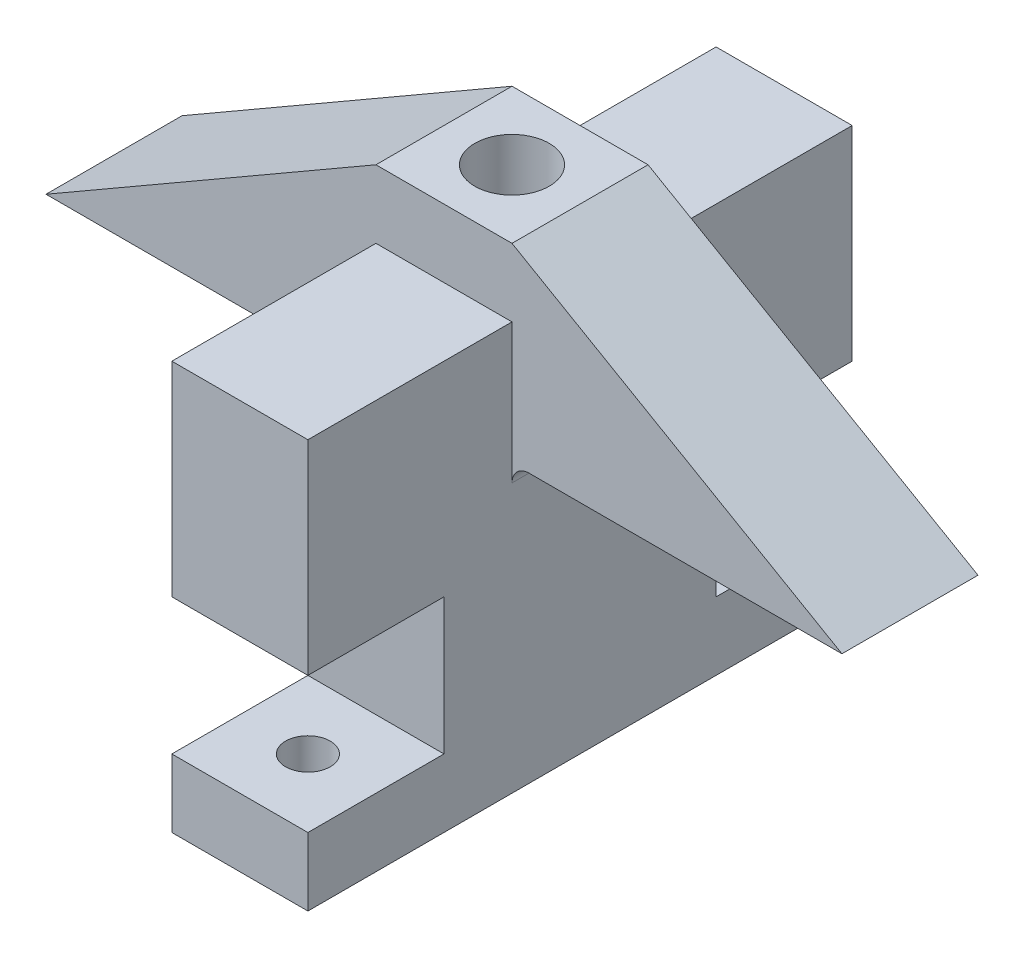
ISO-10303-21;
HEADER;
FILE_DESCRIPTION(('STEP AP214'),'2;1');
FILE_NAME('part.step','',(''),(''),'','','');
FILE_SCHEMA(('AUTOMOTIVE_DESIGN { 1 0 10303 214 1 1 1 1 }'));
ENDSEC;
DATA;
#1=APPLICATION_CONTEXT('core data for automotive mechanical design processes');
#2=APPLICATION_PROTOCOL_DEFINITION('international standard','automotive_design',2000,#1);
#3=PRODUCT_CONTEXT('',#1,'mechanical');
#4=PRODUCT('Part','Part','',(#3));
#5=PRODUCT_RELATED_PRODUCT_CATEGORY('part','',(#4));
#6=PRODUCT_DEFINITION_FORMATION('','',#4);
#7=PRODUCT_DEFINITION_CONTEXT('part definition',#1,'design');
#8=PRODUCT_DEFINITION('design','',#6,#7);
#9=PRODUCT_DEFINITION_SHAPE('','',#8);
#10=(LENGTH_UNIT() NAMED_UNIT(*) SI_UNIT(.MILLI.,.METRE.));
#11=(NAMED_UNIT(*) PLANE_ANGLE_UNIT() SI_UNIT($,.RADIAN.));
#12=(NAMED_UNIT(*) SI_UNIT($,.STERADIAN.) SOLID_ANGLE_UNIT());
#13=UNCERTAINTY_MEASURE_WITH_UNIT(LENGTH_MEASURE(1.E-05),#10,'distance_accuracy_value','');
#14=(GEOMETRIC_REPRESENTATION_CONTEXT(3) GLOBAL_UNCERTAINTY_ASSIGNED_CONTEXT((#13)) GLOBAL_UNIT_ASSIGNED_CONTEXT((#10,
#11,#12)) REPRESENTATION_CONTEXT('',''));
#15=CARTESIAN_POINT('',(0.,0.,0.));
#16=DIRECTION('',(0.,0.,1.));
#17=DIRECTION('',(1.,0.,0.));
#18=AXIS2_PLACEMENT_3D('',#15,#16,#17);
#19=CARTESIAN_POINT('',(0.,0.,0.));
#20=DIRECTION('',(0.,0.,-1.));
#21=DIRECTION('',(-1.,0.,0.));
#22=AXIS2_PLACEMENT_3D('',#19,#20,#21);
#23=PLANE('',#22);
#24=DIRECTION('',(-1.,0.,0.));
#25=VECTOR('',#24,1.);
#26=CARTESIAN_POINT('',(0.,76.2,0.));
#27=LINE('',#26,#25);
#28=CARTESIAN_POINT('',(25.4,76.2,0.));
#29=VERTEX_POINT('',#28);
#30=CARTESIAN_POINT('',(0.,76.2,0.));
#31=VERTEX_POINT('',#30);
#32=EDGE_CURVE('E59',#29,#31,#27,.T.);
#33=ORIENTED_EDGE('',*,*,#32,.T.);
#34=DIRECTION('',(0.,1.,0.));
#35=VECTOR('',#34,1.);
#36=CARTESIAN_POINT('',(0.,0.,0.));
#37=LINE('',#36,#35);
#38=CARTESIAN_POINT('',(0.,50.165,0.));
#39=VERTEX_POINT('',#38);
#40=EDGE_CURVE('E212',#39,#31,#37,.T.);
#41=ORIENTED_EDGE('',*,*,#40,.F.);
#42=CARTESIAN_POINT('',(-3.175,50.165,0.));
#43=DIRECTION('',(0.,0.,-1.));
#44=DIRECTION('',(-1.,0.,0.));
#45=AXIS2_PLACEMENT_3D('',#42,#43,#44);
#46=CIRCLE('',#45,3.175);
#47=CARTESIAN_POINT('',(-3.175,53.34,0.));
#48=VERTEX_POINT('',#47);
#49=EDGE_CURVE('E52',#39,#48,#46,.F.);
#50=ORIENTED_EDGE('',*,*,#49,.T.);
#51=DIRECTION('',(1.,0.,0.));
#52=VECTOR('',#51,1.);
#53=CARTESIAN_POINT('',(0.,53.34,0.));
#54=LINE('',#53,#52);
#55=CARTESIAN_POINT('',(-61.5917267171501,53.34,0.));
#56=VERTEX_POINT('',#55);
#57=EDGE_CURVE('E381',#56,#48,#54,.T.);
#58=ORIENTED_EDGE('',*,*,#57,.F.);
#59=DIRECTION('',(-0.866025403784441,-0.499999999999995,0.));
#60=VECTOR('',#59,1.);
#61=CARTESIAN_POINT('',(-61.5917267171501,53.34,0.));
#62=LINE('',#61,#60);
#63=CARTESIAN_POINT('',(0.,88.9,0.));
#64=VERTEX_POINT('',#63);
#65=EDGE_CURVE('E403',#64,#56,#62,.T.);
#66=ORIENTED_EDGE('',*,*,#65,.F.);
#67=DIRECTION('',(-1.,0.,0.));
#68=VECTOR('',#67,1.);
#69=CARTESIAN_POINT('',(0.,88.9,0.));
#70=LINE('',#69,#68);
#71=CARTESIAN_POINT('',(25.4,88.9,0.));
#72=VERTEX_POINT('',#71);
#73=EDGE_CURVE('E400',#72,#64,#70,.T.);
#74=ORIENTED_EDGE('',*,*,#73,.F.);
#75=DIRECTION('',(-0.866025403784442,0.499999999999995,0.));
#76=VECTOR('',#75,1.);
#77=CARTESIAN_POINT('',(25.4,88.9,0.));
#78=LINE('',#77,#76);
#79=CARTESIAN_POINT('',(86.9917267171501,53.34,0.));
#80=VERTEX_POINT('',#79);
#81=EDGE_CURVE('E397',#80,#72,#78,.T.);
#82=ORIENTED_EDGE('',*,*,#81,.F.);
#83=DIRECTION('',(1.,0.,0.));
#84=VECTOR('',#83,1.);
#85=CARTESIAN_POINT('',(86.9917267171501,53.34,0.));
#86=LINE('',#85,#84);
#87=CARTESIAN_POINT('',(28.575,53.34,0.));
#88=VERTEX_POINT('',#87);
#89=EDGE_CURVE('E376',#88,#80,#86,.T.);
#90=ORIENTED_EDGE('',*,*,#89,.F.);
#91=CARTESIAN_POINT('',(28.575,50.165,0.));
#92=DIRECTION('',(0.,0.,-1.));
#93=DIRECTION('',(-1.,0.,0.));
#94=AXIS2_PLACEMENT_3D('',#91,#92,#93);
#95=CIRCLE('',#94,3.175);
#96=CARTESIAN_POINT('',(25.4,50.165,0.));
#97=VERTEX_POINT('',#96);
#98=EDGE_CURVE('E444',#88,#97,#95,.F.);
#99=ORIENTED_EDGE('',*,*,#98,.T.);
#100=DIRECTION('',(0.,1.,0.));
#101=VECTOR('',#100,1.);
#102=CARTESIAN_POINT('',(25.4,0.,0.));
#103=LINE('',#102,#101);
#104=EDGE_CURVE('E64',#97,#29,#103,.T.);
#105=ORIENTED_EDGE('',*,*,#104,.T.);
#106=EDGE_LOOP('',(#33,#41,#50,#58,#66,#74,#82,#90,#99,#105));
#107=FACE_BOUND('',#106,.T.);
#108=ADVANCED_FACE('F43',(#107),#23,.T.);
#109=CARTESIAN_POINT('',(0.,0.,25.4));
#110=DIRECTION('',(0.,0.,-1.));
#111=DIRECTION('',(-1.,0.,0.));
#112=AXIS2_PLACEMENT_3D('',#109,#110,#111);
#113=PLANE('',#112);
#114=DIRECTION('',(0.,-1.,0.));
#115=VECTOR('',#114,1.);
#116=CARTESIAN_POINT('',(0.,0.,25.4));
#117=LINE('',#116,#115);
#118=CARTESIAN_POINT('',(0.,76.2,25.4));
#119=VERTEX_POINT('',#118);
#120=CARTESIAN_POINT('',(0.,50.165,25.4));
#121=VERTEX_POINT('',#120);
#122=EDGE_CURVE('E254',#119,#121,#117,.T.);
#123=ORIENTED_EDGE('',*,*,#122,.F.);
#124=DIRECTION('',(1.,0.,0.));
#125=VECTOR('',#124,1.);
#126=CARTESIAN_POINT('',(0.,76.2,25.4));
#127=LINE('',#126,#125);
#128=CARTESIAN_POINT('',(25.4,76.2,25.4));
#129=VERTEX_POINT('',#128);
#130=EDGE_CURVE('E260',#119,#129,#127,.T.);
#131=ORIENTED_EDGE('',*,*,#130,.T.);
#132=DIRECTION('',(0.,1.,0.));
#133=VECTOR('',#132,1.);
#134=CARTESIAN_POINT('',(25.4,0.,25.4));
#135=LINE('',#134,#133);
#136=CARTESIAN_POINT('',(25.4,50.165,25.4));
#137=VERTEX_POINT('',#136);
#138=EDGE_CURVE('E274',#137,#129,#135,.T.);
#139=ORIENTED_EDGE('',*,*,#138,.F.);
#140=CARTESIAN_POINT('',(28.575,50.165,25.4));
#141=DIRECTION('',(0.,0.,-1.));
#142=DIRECTION('',(-1.,0.,0.));
#143=AXIS2_PLACEMENT_3D('',#140,#141,#142);
#144=CIRCLE('',#143,3.175);
#145=CARTESIAN_POINT('',(28.575,53.34,25.4));
#146=VERTEX_POINT('',#145);
#147=EDGE_CURVE('E447',#137,#146,#144,.T.);
#148=ORIENTED_EDGE('',*,*,#147,.T.);
#149=DIRECTION('',(1.,0.,0.));
#150=VECTOR('',#149,1.);
#151=CARTESIAN_POINT('',(86.9917267171501,53.34,25.4));
#152=LINE('',#151,#150);
#153=CARTESIAN_POINT('',(86.9917267171501,53.34,25.4));
#154=VERTEX_POINT('',#153);
#155=EDGE_CURVE('E377',#146,#154,#152,.T.);
#156=ORIENTED_EDGE('',*,*,#155,.T.);
#157=DIRECTION('',(-0.866025403784442,0.499999999999995,0.));
#158=VECTOR('',#157,1.);
#159=CARTESIAN_POINT('',(25.4,88.9,25.4));
#160=LINE('',#159,#158);
#161=CARTESIAN_POINT('',(25.4,88.9,25.4));
#162=VERTEX_POINT('',#161);
#163=EDGE_CURVE('E380',#154,#162,#160,.T.);
#164=ORIENTED_EDGE('',*,*,#163,.T.);
#165=DIRECTION('',(-1.,0.,0.));
#166=VECTOR('',#165,1.);
#167=CARTESIAN_POINT('',(0.,88.9,25.4));
#168=LINE('',#167,#166);
#169=CARTESIAN_POINT('',(0.,88.9,25.4));
#170=VERTEX_POINT('',#169);
#171=EDGE_CURVE('E384',#162,#170,#168,.T.);
#172=ORIENTED_EDGE('',*,*,#171,.T.);
#173=DIRECTION('',(-0.866025403784441,-0.499999999999995,0.));
#174=VECTOR('',#173,1.);
#175=CARTESIAN_POINT('',(-61.5917267171501,53.34,25.4));
#176=LINE('',#175,#174);
#177=CARTESIAN_POINT('',(-61.5917267171501,53.34,25.4));
#178=VERTEX_POINT('',#177);
#179=EDGE_CURVE('E387',#170,#178,#176,.T.);
#180=ORIENTED_EDGE('',*,*,#179,.T.);
#181=DIRECTION('',(1.,0.,0.));
#182=VECTOR('',#181,1.);
#183=CARTESIAN_POINT('',(0.,53.34,25.4));
#184=LINE('',#183,#182);
#185=CARTESIAN_POINT('',(-3.175,53.34,25.4));
#186=VERTEX_POINT('',#185);
#187=EDGE_CURVE('E390',#178,#186,#184,.T.);
#188=ORIENTED_EDGE('',*,*,#187,.T.);
#189=CARTESIAN_POINT('',(-3.175,50.165,25.4));
#190=DIRECTION('',(0.,0.,-1.));
#191=DIRECTION('',(-1.,0.,0.));
#192=AXIS2_PLACEMENT_3D('',#189,#190,#191);
#193=CIRCLE('',#192,3.175);
#194=EDGE_CURVE('E11',#186,#121,#193,.T.);
#195=ORIENTED_EDGE('',*,*,#194,.T.);
#196=EDGE_LOOP('',(#123,#131,#139,#148,#156,#164,#172,#180,#188,#195));
#197=FACE_BOUND('',#196,.T.);
#198=ADVANCED_FACE('F462',(#197),#113,.F.);
#199=CARTESIAN_POINT('',(25.4,0.,25.4));
#200=DIRECTION('',(0.,1.,0.));
#201=DIRECTION('',(0.,0.,1.));
#202=AXIS2_PLACEMENT_3D('',#199,#200,#201);
#203=PLANE('',#202);
#204=CARTESIAN_POINT('',(12.7,0.,-25.4));
#205=DIRECTION('',(0.,1.,0.));
#206=DIRECTION('',(0.,0.,1.));
#207=AXIS2_PLACEMENT_3D('',#204,#205,#206);
#208=CIRCLE('',#207,4.1656);
#209=CARTESIAN_POINT('',(12.7,0.,-21.2344));
#210=VERTEX_POINT('',#209);
#211=EDGE_CURVE('E320',#210,#210,#208,.T.);
#212=ORIENTED_EDGE('',*,*,#211,.T.);
#213=EDGE_LOOP('',(#212));
#214=FACE_BOUND('',#213,.T.);
#215=CARTESIAN_POINT('',(12.7,0.,50.8));
#216=DIRECTION('',(0.,1.,0.));
#217=DIRECTION('',(0.,0.,1.));
#218=AXIS2_PLACEMENT_3D('',#215,#216,#217);
#219=CIRCLE('',#218,4.1656);
#220=CARTESIAN_POINT('',(12.7,0.,54.9656));
#221=VERTEX_POINT('',#220);
#222=EDGE_CURVE('E328',#221,#221,#219,.T.);
#223=ORIENTED_EDGE('',*,*,#222,.T.);
#224=EDGE_LOOP('',(#223));
#225=FACE_BOUND('',#224,.T.);
#226=DIRECTION('',(0.,0.,-1.));
#227=VECTOR('',#226,1.);
#228=CARTESIAN_POINT('',(0.,0.,25.4));
#229=LINE('',#228,#227);
#230=CARTESIAN_POINT('',(0.,0.,63.5));
#231=VERTEX_POINT('',#230);
#232=CARTESIAN_POINT('',(0.,0.,-38.1));
#233=VERTEX_POINT('',#232);
#234=EDGE_CURVE('E394',#231,#233,#229,.T.);
#235=ORIENTED_EDGE('',*,*,#234,.T.);
#236=DIRECTION('',(-1.,0.,0.));
#237=VECTOR('',#236,1.);
#238=CARTESIAN_POINT('',(25.4,0.,-38.1));
#239=LINE('',#238,#237);
#240=CARTESIAN_POINT('',(25.4,0.,-38.1));
#241=VERTEX_POINT('',#240);
#242=EDGE_CURVE('E336',#241,#233,#239,.T.);
#243=ORIENTED_EDGE('',*,*,#242,.F.);
#244=DIRECTION('',(0.,0.,-1.));
#245=VECTOR('',#244,1.);
#246=CARTESIAN_POINT('',(25.4,0.,25.4));
#247=LINE('',#246,#245);
#248=CARTESIAN_POINT('',(25.4,0.,63.5));
#249=VERTEX_POINT('',#248);
#250=EDGE_CURVE('E427',#249,#241,#247,.T.);
#251=ORIENTED_EDGE('',*,*,#250,.F.);
#252=DIRECTION('',(1.,0.,0.));
#253=VECTOR('',#252,1.);
#254=CARTESIAN_POINT('',(0.,0.,63.5));
#255=LINE('',#254,#253);
#256=EDGE_CURVE('E358',#231,#249,#255,.T.);
#257=ORIENTED_EDGE('',*,*,#256,.F.);
#258=EDGE_LOOP('',(#235,#243,#251,#257));
#259=FACE_BOUND('',#258,.T.);
#260=ADVANCED_FACE('F507',(#214,#225,#259),#203,.F.);
#261=CARTESIAN_POINT('',(25.4,53.34,25.4));
#262=DIRECTION('',(-1.,0.,0.));
#263=DIRECTION('',(0.,0.,1.));
#264=AXIS2_PLACEMENT_3D('',#261,#262,#263);
#265=PLANE('',#264);
#266=ORIENTED_EDGE('',*,*,#104,.F.);
#267=DIRECTION('',(0.,0.,-1.));
#268=VECTOR('',#267,1.);
#269=CARTESIAN_POINT('',(25.4,50.165,25.4));
#270=LINE('',#269,#268);
#271=EDGE_CURVE('E434',#97,#137,#270,.F.);
#272=ORIENTED_EDGE('',*,*,#271,.T.);
#273=ORIENTED_EDGE('',*,*,#138,.T.);
#274=DIRECTION('',(0.,0.,-1.));
#275=VECTOR('',#274,1.);
#276=CARTESIAN_POINT('',(25.4,76.2,63.5));
#277=LINE('',#276,#275);
#278=CARTESIAN_POINT('',(25.4,76.2,63.5));
#279=VERTEX_POINT('',#278);
#280=EDGE_CURVE('E283',#279,#129,#277,.T.);
#281=ORIENTED_EDGE('',*,*,#280,.F.);
#282=DIRECTION('',(0.,1.,0.));
#283=VECTOR('',#282,1.);
#284=CARTESIAN_POINT('',(25.4,0.,63.5));
#285=LINE('',#284,#283);
#286=CARTESIAN_POINT('',(25.4,38.1,63.5));
#287=VERTEX_POINT('',#286);
#288=EDGE_CURVE('E263',#287,#279,#285,.T.);
#289=ORIENTED_EDGE('',*,*,#288,.F.);
#290=DIRECTION('',(0.,0.,-1.));
#291=VECTOR('',#290,1.);
#292=CARTESIAN_POINT('',(25.4,38.1,63.5));
#293=LINE('',#292,#291);
#294=CARTESIAN_POINT('',(25.4,38.1,38.1));
#295=VERTEX_POINT('',#294);
#296=EDGE_CURVE('E287',#287,#295,#293,.T.);
#297=ORIENTED_EDGE('',*,*,#296,.T.);
#298=DIRECTION('',(0.,1.,0.));
#299=VECTOR('',#298,1.);
#300=CARTESIAN_POINT('',(25.4,0.,38.1));
#301=LINE('',#300,#299);
#302=CARTESIAN_POINT('',(25.4,12.7,38.1));
#303=VERTEX_POINT('',#302);
#304=EDGE_CURVE('E305',#303,#295,#301,.T.);
#305=ORIENTED_EDGE('',*,*,#304,.F.);
#306=DIRECTION('',(0.,0.,-1.));
#307=VECTOR('',#306,1.);
#308=CARTESIAN_POINT('',(25.4,12.7,63.5));
#309=LINE('',#308,#307);
#310=CARTESIAN_POINT('',(25.4,12.7,63.5));
#311=VERTEX_POINT('',#310);
#312=EDGE_CURVE('E372',#311,#303,#309,.T.);
#313=ORIENTED_EDGE('',*,*,#312,.F.);
#314=DIRECTION('',(0.,1.,0.));
#315=VECTOR('',#314,1.);
#316=CARTESIAN_POINT('',(25.4,0.,63.5));
#317=LINE('',#316,#315);
#318=EDGE_CURVE('E362',#249,#311,#317,.T.);
#319=ORIENTED_EDGE('',*,*,#318,.F.);
#320=ORIENTED_EDGE('',*,*,#250,.T.);
#321=DIRECTION('',(0.,-1.,0.));
#322=VECTOR('',#321,1.);
#323=CARTESIAN_POINT('',(25.4,0.,-38.1));
#324=LINE('',#323,#322);
#325=CARTESIAN_POINT('',(25.4,12.7,-38.1));
#326=VERTEX_POINT('',#325);
#327=EDGE_CURVE('E332',#326,#241,#324,.T.);
#328=ORIENTED_EDGE('',*,*,#327,.F.);
#329=DIRECTION('',(0.,0.,1.));
#330=VECTOR('',#329,1.);
#331=CARTESIAN_POINT('',(25.4,12.7,-38.1));
#332=LINE('',#331,#330);
#333=CARTESIAN_POINT('',(25.4,12.7,-12.7));
#334=VERTEX_POINT('',#333);
#335=EDGE_CURVE('E346',#326,#334,#332,.T.);
#336=ORIENTED_EDGE('',*,*,#335,.T.);
#337=DIRECTION('',(0.,-1.,0.));
#338=VECTOR('',#337,1.);
#339=CARTESIAN_POINT('',(25.4,0.,-12.7));
#340=LINE('',#339,#338);
#341=CARTESIAN_POINT('',(25.4,38.1,-12.7));
#342=VERTEX_POINT('',#341);
#343=EDGE_CURVE('E245',#342,#334,#340,.T.);
#344=ORIENTED_EDGE('',*,*,#343,.F.);
#345=DIRECTION('',(0.,0.,1.));
#346=VECTOR('',#345,1.);
#347=CARTESIAN_POINT('',(25.4,38.1,-38.1));
#348=LINE('',#347,#346);
#349=CARTESIAN_POINT('',(25.4,38.1,-38.1));
#350=VERTEX_POINT('',#349);
#351=EDGE_CURVE('E236',#350,#342,#348,.T.);
#352=ORIENTED_EDGE('',*,*,#351,.F.);
#353=DIRECTION('',(0.,1.,0.));
#354=VECTOR('',#353,1.);
#355=CARTESIAN_POINT('',(25.4,0.,-38.1));
#356=LINE('',#355,#354);
#357=CARTESIAN_POINT('',(25.4,76.2,-38.1));
#358=VERTEX_POINT('',#357);
#359=EDGE_CURVE('E220',#350,#358,#356,.T.);
#360=ORIENTED_EDGE('',*,*,#359,.T.);
#361=DIRECTION('',(0.,0.,1.));
#362=VECTOR('',#361,1.);
#363=CARTESIAN_POINT('',(25.4,76.2,-38.1));
#364=LINE('',#363,#362);
#365=EDGE_CURVE('E216',#358,#29,#364,.T.);
#366=ORIENTED_EDGE('',*,*,#365,.T.);
#367=EDGE_LOOP('',(#266,#272,#273,#281,#289,#297,#305,#313,#319,#320,#328,#336,#344,#352,#360,#366));
#368=FACE_BOUND('',#367,.T.);
#369=ADVANCED_FACE('F487',(#368),#265,.F.);
#370=CARTESIAN_POINT('',(86.9917267171501,53.34,25.4));
#371=DIRECTION('',(0.,1.,0.));
#372=DIRECTION('',(-1.,0.,0.));
#373=AXIS2_PLACEMENT_3D('',#370,#371,#372);
#374=PLANE('',#373);
#375=ORIENTED_EDGE('',*,*,#155,.F.);
#376=DIRECTION('',(0.,0.,-1.));
#377=VECTOR('',#376,1.);
#378=CARTESIAN_POINT('',(28.575,53.34,0.));
#379=LINE('',#378,#377);
#380=EDGE_CURVE('E430',#146,#88,#379,.T.);
#381=ORIENTED_EDGE('',*,*,#380,.T.);
#382=ORIENTED_EDGE('',*,*,#89,.T.);
#383=DIRECTION('',(0.,0.,-1.));
#384=VECTOR('',#383,1.);
#385=CARTESIAN_POINT('',(86.9917267171501,53.34,25.4));
#386=LINE('',#385,#384);
#387=EDGE_CURVE('E423',#154,#80,#386,.T.);
#388=ORIENTED_EDGE('',*,*,#387,.F.);
#389=EDGE_LOOP('',(#375,#381,#382,#388));
#390=FACE_BOUND('',#389,.T.);
#391=ADVANCED_FACE('F480',(#390),#374,.F.);
#392=CARTESIAN_POINT('',(25.4,88.9,25.4));
#393=DIRECTION('',(-0.499999999999995,-0.866025403784442,0.));
#394=DIRECTION('',(0.866025403784442,-0.499999999999995,0.));
#395=AXIS2_PLACEMENT_3D('',#392,#393,#394);
#396=PLANE('',#395);
#397=ORIENTED_EDGE('',*,*,#81,.T.);
#398=DIRECTION('',(0.,0.,-1.));
#399=VECTOR('',#398,1.);
#400=CARTESIAN_POINT('',(25.4,88.9,25.4));
#401=LINE('',#400,#399);
#402=EDGE_CURVE('E419',#162,#72,#401,.T.);
#403=ORIENTED_EDGE('',*,*,#402,.F.);
#404=ORIENTED_EDGE('',*,*,#163,.F.);
#405=ORIENTED_EDGE('',*,*,#387,.T.);
#406=EDGE_LOOP('',(#397,#403,#404,#405));
#407=FACE_BOUND('',#406,.T.);
#408=ADVANCED_FACE('F476',(#407),#396,.F.);
#409=CARTESIAN_POINT('',(0.,88.9,25.4));
#410=DIRECTION('',(0.,-1.,0.));
#411=DIRECTION('',(0.,0.,-1.));
#412=AXIS2_PLACEMENT_3D('',#409,#410,#411);
#413=PLANE('',#412);
#414=CARTESIAN_POINT('',(12.7,88.9,12.7));
#415=DIRECTION('',(0.,1.,0.));
#416=DIRECTION('',(0.,0.,1.));
#417=AXIS2_PLACEMENT_3D('',#414,#415,#416);
#418=CIRCLE('',#417,6.94689999999999);
#419=CARTESIAN_POINT('',(12.7,88.9,19.6469));
#420=VERTEX_POINT('',#419);
#421=EDGE_CURVE('E308',#420,#420,#418,.T.);
#422=ORIENTED_EDGE('',*,*,#421,.F.);
#423=EDGE_LOOP('',(#422));
#424=FACE_BOUND('',#423,.T.);
#425=ORIENTED_EDGE('',*,*,#73,.T.);
#426=DIRECTION('',(0.,0.,-1.));
#427=VECTOR('',#426,1.);
#428=CARTESIAN_POINT('',(0.,88.9,25.4));
#429=LINE('',#428,#427);
#430=EDGE_CURVE('E415',#170,#64,#429,.T.);
#431=ORIENTED_EDGE('',*,*,#430,.F.);
#432=ORIENTED_EDGE('',*,*,#171,.F.);
#433=ORIENTED_EDGE('',*,*,#402,.T.);
#434=EDGE_LOOP('',(#425,#431,#432,#433));
#435=FACE_BOUND('',#434,.T.);
#436=ADVANCED_FACE('F472',(#424,#435),#413,.F.);
#437=CARTESIAN_POINT('',(-61.5917267171501,53.34,25.4));
#438=DIRECTION('',(0.499999999999995,-0.866025403784441,0.));
#439=DIRECTION('',(0.866025403784442,0.499999999999995,0.));
#440=AXIS2_PLACEMENT_3D('',#437,#438,#439);
#441=PLANE('',#440);
#442=ORIENTED_EDGE('',*,*,#65,.T.);
#443=DIRECTION('',(0.,0.,-1.));
#444=VECTOR('',#443,1.);
#445=CARTESIAN_POINT('',(-61.5917267171501,53.34,25.4));
#446=LINE('',#445,#444);
#447=EDGE_CURVE('E411',#178,#56,#446,.T.);
#448=ORIENTED_EDGE('',*,*,#447,.F.);
#449=ORIENTED_EDGE('',*,*,#179,.F.);
#450=ORIENTED_EDGE('',*,*,#430,.T.);
#451=EDGE_LOOP('',(#442,#448,#449,#450));
#452=FACE_BOUND('',#451,.T.);
#453=ADVANCED_FACE('F467',(#452),#441,.F.);
#454=CARTESIAN_POINT('',(0.,53.34,25.4));
#455=DIRECTION('',(0.,1.,0.));
#456=DIRECTION('',(-1.,0.,0.));
#457=AXIS2_PLACEMENT_3D('',#454,#455,#456);
#458=PLANE('',#457);
#459=ORIENTED_EDGE('',*,*,#57,.T.);
#460=DIRECTION('',(0.,0.,-1.));
#461=VECTOR('',#460,1.);
#462=CARTESIAN_POINT('',(-3.175,53.34,25.4));
#463=LINE('',#462,#461);
#464=EDGE_CURVE('E441',#48,#186,#463,.F.);
#465=ORIENTED_EDGE('',*,*,#464,.T.);
#466=ORIENTED_EDGE('',*,*,#187,.F.);
#467=ORIENTED_EDGE('',*,*,#447,.T.);
#468=EDGE_LOOP('',(#459,#465,#466,#467));
#469=FACE_BOUND('',#468,.T.);
#470=ADVANCED_FACE('F457',(#469),#458,.F.);
#471=CARTESIAN_POINT('',(0.,0.,25.4));
#472=DIRECTION('',(1.,0.,0.));
#473=DIRECTION('',(0.,0.,-1.));
#474=AXIS2_PLACEMENT_3D('',#471,#472,#473);
#475=PLANE('',#474);
#476=DIRECTION('',(0.,0.,-1.));
#477=VECTOR('',#476,1.);
#478=CARTESIAN_POINT('',(0.,50.165,0.));
#479=LINE('',#478,#477);
#480=EDGE_CURVE('E438',#121,#39,#479,.T.);
#481=ORIENTED_EDGE('',*,*,#480,.T.);
#482=ORIENTED_EDGE('',*,*,#40,.T.);
#483=DIRECTION('',(0.,0.,1.));
#484=VECTOR('',#483,1.);
#485=CARTESIAN_POINT('',(0.,76.2,-38.1));
#486=LINE('',#485,#484);
#487=CARTESIAN_POINT('',(0.,76.2,-38.1));
#488=VERTEX_POINT('',#487);
#489=EDGE_CURVE('E209',#488,#31,#486,.T.);
#490=ORIENTED_EDGE('',*,*,#489,.F.);
#491=DIRECTION('',(0.,1.,0.));
#492=VECTOR('',#491,1.);
#493=CARTESIAN_POINT('',(0.,0.,-38.1));
#494=LINE('',#493,#492);
#495=CARTESIAN_POINT('',(0.,38.1,-38.1));
#496=VERTEX_POINT('',#495);
#497=EDGE_CURVE('E194',#496,#488,#494,.T.);
#498=ORIENTED_EDGE('',*,*,#497,.F.);
#499=DIRECTION('',(0.,0.,1.));
#500=VECTOR('',#499,1.);
#501=CARTESIAN_POINT('',(0.,38.1,-38.1));
#502=LINE('',#501,#500);
#503=CARTESIAN_POINT('',(0.,38.1,-12.7));
#504=VERTEX_POINT('',#503);
#505=EDGE_CURVE('E227',#496,#504,#502,.T.);
#506=ORIENTED_EDGE('',*,*,#505,.T.);
#507=DIRECTION('',(0.,1.,0.));
#508=VECTOR('',#507,1.);
#509=CARTESIAN_POINT('',(0.,0.,-12.7));
#510=LINE('',#509,#508);
#511=CARTESIAN_POINT('',(0.,12.7,-12.7));
#512=VERTEX_POINT('',#511);
#513=EDGE_CURVE('E251',#512,#504,#510,.T.);
#514=ORIENTED_EDGE('',*,*,#513,.F.);
#515=DIRECTION('',(0.,0.,1.));
#516=VECTOR('',#515,1.);
#517=CARTESIAN_POINT('',(0.,12.7,-38.1));
#518=LINE('',#517,#516);
#519=CARTESIAN_POINT('',(0.,12.7,-38.1));
#520=VERTEX_POINT('',#519);
#521=EDGE_CURVE('E350',#520,#512,#518,.T.);
#522=ORIENTED_EDGE('',*,*,#521,.F.);
#523=DIRECTION('',(0.,1.,0.));
#524=VECTOR('',#523,1.);
#525=CARTESIAN_POINT('',(0.,0.,-38.1));
#526=LINE('',#525,#524);
#527=EDGE_CURVE('E340',#233,#520,#526,.T.);
#528=ORIENTED_EDGE('',*,*,#527,.F.);
#529=ORIENTED_EDGE('',*,*,#234,.F.);
#530=DIRECTION('',(0.,-1.,0.));
#531=VECTOR('',#530,1.);
#532=CARTESIAN_POINT('',(0.,0.,63.5));
#533=LINE('',#532,#531);
#534=CARTESIAN_POINT('',(0.,12.7,63.5));
#535=VERTEX_POINT('',#534);
#536=EDGE_CURVE('E354',#535,#231,#533,.T.);
#537=ORIENTED_EDGE('',*,*,#536,.F.);
#538=DIRECTION('',(0.,0.,-1.));
#539=VECTOR('',#538,1.);
#540=CARTESIAN_POINT('',(0.,12.7,63.5));
#541=LINE('',#540,#539);
#542=CARTESIAN_POINT('',(0.,12.7,38.1));
#543=VERTEX_POINT('',#542);
#544=EDGE_CURVE('E368',#535,#543,#541,.T.);
#545=ORIENTED_EDGE('',*,*,#544,.T.);
#546=DIRECTION('',(0.,-1.,0.));
#547=VECTOR('',#546,1.);
#548=CARTESIAN_POINT('',(0.,0.,38.1));
#549=LINE('',#548,#547);
#550=CARTESIAN_POINT('',(0.,38.1,38.1));
#551=VERTEX_POINT('',#550);
#552=EDGE_CURVE('E299',#551,#543,#549,.T.);
#553=ORIENTED_EDGE('',*,*,#552,.F.);
#554=DIRECTION('',(0.,0.,-1.));
#555=VECTOR('',#554,1.);
#556=CARTESIAN_POINT('',(0.,38.1,63.5));
#557=LINE('',#556,#555);
#558=CARTESIAN_POINT('',(0.,38.1,63.5));
#559=VERTEX_POINT('',#558);
#560=EDGE_CURVE('E291',#559,#551,#557,.T.);
#561=ORIENTED_EDGE('',*,*,#560,.F.);
#562=DIRECTION('',(0.,-1.,0.));
#563=VECTOR('',#562,1.);
#564=CARTESIAN_POINT('',(0.,0.,63.5));
#565=LINE('',#564,#563);
#566=CARTESIAN_POINT('',(0.,76.2,63.5));
#567=VERTEX_POINT('',#566);
#568=EDGE_CURVE('E255',#567,#559,#565,.T.);
#569=ORIENTED_EDGE('',*,*,#568,.F.);
#570=DIRECTION('',(0.,0.,-1.));
#571=VECTOR('',#570,1.);
#572=CARTESIAN_POINT('',(0.,76.2,63.5));
#573=LINE('',#572,#571);
#574=EDGE_CURVE('E270',#567,#119,#573,.T.);
#575=ORIENTED_EDGE('',*,*,#574,.T.);
#576=ORIENTED_EDGE('',*,*,#122,.T.);
#577=EDGE_LOOP('',(#481,#482,#490,#498,#506,#514,#522,#528,#529,#537,#545,#553,#561,#569,#575,#576));
#578=FACE_BOUND('',#577,.T.);
#579=ADVANCED_FACE('F211',(#578),#475,.F.);
#580=CARTESIAN_POINT('',(0.,12.7,63.5));
#581=DIRECTION('',(0.,-1.,0.));
#582=DIRECTION('',(0.,0.,-1.));
#583=AXIS2_PLACEMENT_3D('',#580,#581,#582);
#584=PLANE('',#583);
#585=CARTESIAN_POINT('',(12.7,12.7,50.8));
#586=DIRECTION('',(0.,1.,0.));
#587=DIRECTION('',(0.,0.,1.));
#588=AXIS2_PLACEMENT_3D('',#585,#586,#587);
#589=CIRCLE('',#588,4.1656);
#590=CARTESIAN_POINT('',(12.7,12.7,54.9656));
#591=VERTEX_POINT('',#590);
#592=EDGE_CURVE('E324',#591,#591,#589,.T.);
#593=ORIENTED_EDGE('',*,*,#592,.F.);
#594=EDGE_LOOP('',(#593));
#595=FACE_BOUND('',#594,.T.);
#596=ORIENTED_EDGE('',*,*,#312,.T.);
#597=DIRECTION('',(1.,0.,0.));
#598=VECTOR('',#597,1.);
#599=CARTESIAN_POINT('',(0.,12.7,38.1));
#600=LINE('',#599,#598);
#601=EDGE_CURVE('E302',#543,#303,#600,.T.);
#602=ORIENTED_EDGE('',*,*,#601,.F.);
#603=ORIENTED_EDGE('',*,*,#544,.F.);
#604=DIRECTION('',(-1.,0.,0.));
#605=VECTOR('',#604,1.);
#606=CARTESIAN_POINT('',(0.,12.7,63.5));
#607=LINE('',#606,#605);
#608=EDGE_CURVE('E365',#311,#535,#607,.T.);
#609=ORIENTED_EDGE('',*,*,#608,.F.);
#610=EDGE_LOOP('',(#596,#602,#603,#609));
#611=FACE_BOUND('',#610,.T.);
#612=ADVANCED_FACE('F516',(#595,#611),#584,.F.);
#613=CARTESIAN_POINT('',(0.,0.,63.5));
#614=DIRECTION('',(0.,0.,-1.));
#615=DIRECTION('',(-1.,0.,0.));
#616=AXIS2_PLACEMENT_3D('',#613,#614,#615);
#617=PLANE('',#616);
#618=ORIENTED_EDGE('',*,*,#536,.T.);
#619=ORIENTED_EDGE('',*,*,#256,.T.);
#620=ORIENTED_EDGE('',*,*,#318,.T.);
#621=ORIENTED_EDGE('',*,*,#608,.T.);
#622=EDGE_LOOP('',(#618,#619,#620,#621));
#623=FACE_BOUND('',#622,.T.);
#624=ADVANCED_FACE('F510',(#623),#617,.F.);
#625=CARTESIAN_POINT('',(25.4,12.7,-38.1));
#626=DIRECTION('',(0.,-1.,0.));
#627=DIRECTION('',(0.,0.,-1.));
#628=AXIS2_PLACEMENT_3D('',#625,#626,#627);
#629=PLANE('',#628);
#630=CARTESIAN_POINT('',(12.7,12.7,-25.4));
#631=DIRECTION('',(0.,1.,0.));
#632=DIRECTION('',(0.,0.,1.));
#633=AXIS2_PLACEMENT_3D('',#630,#631,#632);
#634=CIRCLE('',#633,4.1656);
#635=CARTESIAN_POINT('',(12.7,12.7,-21.2344));
#636=VERTEX_POINT('',#635);
#637=EDGE_CURVE('E316',#636,#636,#634,.T.);
#638=ORIENTED_EDGE('',*,*,#637,.F.);
#639=EDGE_LOOP('',(#638));
#640=FACE_BOUND('',#639,.T.);
#641=ORIENTED_EDGE('',*,*,#521,.T.);
#642=DIRECTION('',(-1.,0.,0.));
#643=VECTOR('',#642,1.);
#644=CARTESIAN_POINT('',(0.,12.7,-12.7));
#645=LINE('',#644,#643);
#646=EDGE_CURVE('E248',#334,#512,#645,.T.);
#647=ORIENTED_EDGE('',*,*,#646,.F.);
#648=ORIENTED_EDGE('',*,*,#335,.F.);
#649=DIRECTION('',(1.,0.,0.));
#650=VECTOR('',#649,1.);
#651=CARTESIAN_POINT('',(25.4,12.7,-38.1));
#652=LINE('',#651,#650);
#653=EDGE_CURVE('E343',#520,#326,#652,.T.);
#654=ORIENTED_EDGE('',*,*,#653,.F.);
#655=EDGE_LOOP('',(#641,#647,#648,#654));
#656=FACE_BOUND('',#655,.T.);
#657=ADVANCED_FACE('F498',(#640,#656),#629,.F.);
#658=CARTESIAN_POINT('',(0.,0.,-38.1));
#659=DIRECTION('',(0.,0.,1.));
#660=DIRECTION('',(1.,0.,0.));
#661=AXIS2_PLACEMENT_3D('',#658,#659,#660);
#662=PLANE('',#661);
#663=ORIENTED_EDGE('',*,*,#327,.T.);
#664=ORIENTED_EDGE('',*,*,#242,.T.);
#665=ORIENTED_EDGE('',*,*,#527,.T.);
#666=ORIENTED_EDGE('',*,*,#653,.T.);
#667=EDGE_LOOP('',(#663,#664,#665,#666));
#668=FACE_BOUND('',#667,.T.);
#669=ADVANCED_FACE('F502',(#668),#662,.F.);
#670=CARTESIAN_POINT('',(12.7,12.7,50.8));
#671=DIRECTION('',(0.,1.,0.));
#672=DIRECTION('',(0.,0.,1.));
#673=AXIS2_PLACEMENT_3D('',#670,#671,#672);
#674=CYLINDRICAL_SURFACE('',#673,4.1656);
#675=ORIENTED_EDGE('',*,*,#222,.F.);
#676=EDGE_LOOP('',(#675));
#677=FACE_BOUND('',#676,.T.);
#678=ORIENTED_EDGE('',*,*,#592,.T.);
#679=EDGE_LOOP('',(#678));
#680=FACE_BOUND('',#679,.T.);
#681=ADVANCED_FACE('F589',(#677,#680),#674,.F.);
#682=CARTESIAN_POINT('',(12.7,12.7,-25.4));
#683=DIRECTION('',(0.,1.,0.));
#684=DIRECTION('',(0.,0.,1.));
#685=AXIS2_PLACEMENT_3D('',#682,#683,#684);
#686=CYLINDRICAL_SURFACE('',#685,4.1656);
#687=ORIENTED_EDGE('',*,*,#211,.F.);
#688=EDGE_LOOP('',(#687));
#689=FACE_BOUND('',#688,.T.);
#690=ORIENTED_EDGE('',*,*,#637,.T.);
#691=EDGE_LOOP('',(#690));
#692=FACE_BOUND('',#691,.T.);
#693=ADVANCED_FACE('F580',(#689,#692),#686,.F.);
#694=CARTESIAN_POINT('',(12.7,53.848,12.7));
#695=DIRECTION('',(0.,1.,0.));
#696=DIRECTION('',(0.,0.,1.));
#697=AXIS2_PLACEMENT_3D('',#694,#695,#696);
#698=CONICAL_SURFACE('',#697,6.94689999999999,1.02974425867665);
#699=CARTESIAN_POINT('',(12.7,49.6738813656774,12.7));
#700=VERTEX_POINT('',#699);
#701=VERTEX_LOOP('',#700);
#702=FACE_BOUND('',#701,.T.);
#703=CARTESIAN_POINT('',(12.7,53.848,12.7));
#704=DIRECTION('',(0.,1.,0.));
#705=DIRECTION('',(0.,0.,1.));
#706=AXIS2_PLACEMENT_3D('',#703,#704,#705);
#707=CIRCLE('',#706,6.94689999999999);
#708=CARTESIAN_POINT('',(12.7,53.848,19.6469));
#709=VERTEX_POINT('',#708);
#710=EDGE_CURVE('E312',#709,#709,#707,.T.);
#711=ORIENTED_EDGE('',*,*,#710,.T.);
#712=EDGE_LOOP('',(#711));
#713=FACE_BOUND('',#712,.T.);
#714=ADVANCED_FACE('F574',(#702,#713),#698,.F.);
#715=CARTESIAN_POINT('',(12.7,88.9,12.7));
#716=DIRECTION('',(0.,1.,0.));
#717=DIRECTION('',(0.,0.,1.));
#718=AXIS2_PLACEMENT_3D('',#715,#716,#717);
#719=CYLINDRICAL_SURFACE('',#718,6.94689999999999);
#720=ORIENTED_EDGE('',*,*,#710,.F.);
#721=EDGE_LOOP('',(#720));
#722=FACE_BOUND('',#721,.T.);
#723=ORIENTED_EDGE('',*,*,#421,.T.);
#724=EDGE_LOOP('',(#723));
#725=FACE_BOUND('',#724,.T.);
#726=ADVANCED_FACE('F569',(#722,#725),#719,.F.);
#727=CARTESIAN_POINT('',(28.575,50.165,25.4));
#728=DIRECTION('',(0.,0.,1.));
#729=DIRECTION('',(1.,0.,0.));
#730=AXIS2_PLACEMENT_3D('',#727,#728,#729);
#731=CYLINDRICAL_SURFACE('',#730,3.175);
#732=ORIENTED_EDGE('',*,*,#147,.F.);
#733=ORIENTED_EDGE('',*,*,#271,.F.);
#734=ORIENTED_EDGE('',*,*,#98,.F.);
#735=ORIENTED_EDGE('',*,*,#380,.F.);
#736=EDGE_LOOP('',(#732,#733,#734,#735));
#737=FACE_BOUND('',#736,.T.);
#738=ADVANCED_FACE('F485',(#737),#731,.F.);
#739=CARTESIAN_POINT('',(-3.175,50.165,25.4));
#740=DIRECTION('',(0.,0.,1.));
#741=DIRECTION('',(1.,0.,0.));
#742=AXIS2_PLACEMENT_3D('',#739,#740,#741);
#743=CYLINDRICAL_SURFACE('',#742,3.175);
#744=ORIENTED_EDGE('',*,*,#194,.F.);
#745=ORIENTED_EDGE('',*,*,#464,.F.);
#746=ORIENTED_EDGE('',*,*,#49,.F.);
#747=ORIENTED_EDGE('',*,*,#480,.F.);
#748=EDGE_LOOP('',(#744,#745,#746,#747));
#749=FACE_BOUND('',#748,.T.);
#750=ADVANCED_FACE('F45',(#749),#743,.F.);
#751=CARTESIAN_POINT('',(0.,0.,38.1));
#752=DIRECTION('',(0.,0.,1.));
#753=DIRECTION('',(1.,0.,0.));
#754=AXIS2_PLACEMENT_3D('',#751,#752,#753);
#755=PLANE('',#754);
#756=DIRECTION('',(1.,0.,0.));
#757=VECTOR('',#756,1.);
#758=CARTESIAN_POINT('',(0.,38.1,38.1));
#759=LINE('',#758,#757);
#760=EDGE_CURVE('E295',#551,#295,#759,.T.);
#761=ORIENTED_EDGE('',*,*,#760,.F.);
#762=ORIENTED_EDGE('',*,*,#552,.T.);
#763=ORIENTED_EDGE('',*,*,#601,.T.);
#764=ORIENTED_EDGE('',*,*,#304,.T.);
#765=EDGE_LOOP('',(#761,#762,#763,#764));
#766=FACE_BOUND('',#765,.T.);
#767=ADVANCED_FACE('F521',(#766),#755,.T.);
#768=CARTESIAN_POINT('',(0.,38.1,63.5));
#769=DIRECTION('',(0.,1.,0.));
#770=DIRECTION('',(0.,0.,1.));
#771=AXIS2_PLACEMENT_3D('',#768,#769,#770);
#772=PLANE('',#771);
#773=ORIENTED_EDGE('',*,*,#760,.T.);
#774=ORIENTED_EDGE('',*,*,#296,.F.);
#775=DIRECTION('',(1.,0.,0.));
#776=VECTOR('',#775,1.);
#777=CARTESIAN_POINT('',(0.,38.1,63.5));
#778=LINE('',#777,#776);
#779=EDGE_CURVE('E259',#559,#287,#778,.T.);
#780=ORIENTED_EDGE('',*,*,#779,.F.);
#781=ORIENTED_EDGE('',*,*,#560,.T.);
#782=EDGE_LOOP('',(#773,#774,#780,#781));
#783=FACE_BOUND('',#782,.T.);
#784=ADVANCED_FACE('F525',(#783),#772,.F.);
#785=CARTESIAN_POINT('',(0.,76.2,63.5));
#786=DIRECTION('',(0.,1.,0.));
#787=DIRECTION('',(0.,0.,1.));
#788=AXIS2_PLACEMENT_3D('',#785,#786,#787);
#789=PLANE('',#788);
#790=ORIENTED_EDGE('',*,*,#130,.F.);
#791=ORIENTED_EDGE('',*,*,#574,.F.);
#792=DIRECTION('',(1.,0.,0.));
#793=VECTOR('',#792,1.);
#794=CARTESIAN_POINT('',(0.,76.2,63.5));
#795=LINE('',#794,#793);
#796=EDGE_CURVE('E266',#567,#279,#795,.T.);
#797=ORIENTED_EDGE('',*,*,#796,.T.);
#798=ORIENTED_EDGE('',*,*,#280,.T.);
#799=EDGE_LOOP('',(#790,#791,#797,#798));
#800=FACE_BOUND('',#799,.T.);
#801=ADVANCED_FACE('F532',(#800),#789,.T.);
#802=CARTESIAN_POINT('',(0.,0.,63.5));
#803=DIRECTION('',(0.,0.,1.));
#804=DIRECTION('',(1.,0.,0.));
#805=AXIS2_PLACEMENT_3D('',#802,#803,#804);
#806=PLANE('',#805);
#807=ORIENTED_EDGE('',*,*,#568,.T.);
#808=ORIENTED_EDGE('',*,*,#779,.T.);
#809=ORIENTED_EDGE('',*,*,#288,.T.);
#810=ORIENTED_EDGE('',*,*,#796,.F.);
#811=EDGE_LOOP('',(#807,#808,#809,#810));
#812=FACE_BOUND('',#811,.T.);
#813=ADVANCED_FACE('F529',(#812),#806,.T.);
#814=CARTESIAN_POINT('',(0.,0.,-12.7));
#815=DIRECTION('',(0.,0.,-1.));
#816=DIRECTION('',(-1.,0.,0.));
#817=AXIS2_PLACEMENT_3D('',#814,#815,#816);
#818=PLANE('',#817);
#819=DIRECTION('',(-1.,0.,0.));
#820=VECTOR('',#819,1.);
#821=CARTESIAN_POINT('',(0.,38.1,-12.7));
#822=LINE('',#821,#820);
#823=EDGE_CURVE('E215',#342,#504,#822,.T.);
#824=ORIENTED_EDGE('',*,*,#823,.F.);
#825=ORIENTED_EDGE('',*,*,#343,.T.);
#826=ORIENTED_EDGE('',*,*,#646,.T.);
#827=ORIENTED_EDGE('',*,*,#513,.T.);
#828=EDGE_LOOP('',(#824,#825,#826,#827));
#829=FACE_BOUND('',#828,.T.);
#830=ADVANCED_FACE('F540',(#829),#818,.T.);
#831=CARTESIAN_POINT('',(0.,76.2,-38.1));
#832=DIRECTION('',(0.,1.,0.));
#833=DIRECTION('',(0.,0.,1.));
#834=AXIS2_PLACEMENT_3D('',#831,#832,#833);
#835=PLANE('',#834);
#836=ORIENTED_EDGE('',*,*,#32,.F.);
#837=ORIENTED_EDGE('',*,*,#365,.F.);
#838=DIRECTION('',(-1.,0.,0.));
#839=VECTOR('',#838,1.);
#840=CARTESIAN_POINT('',(0.,76.2,-38.1));
#841=LINE('',#840,#839);
#842=EDGE_CURVE('E199',#358,#488,#841,.T.);
#843=ORIENTED_EDGE('',*,*,#842,.T.);
#844=ORIENTED_EDGE('',*,*,#489,.T.);
#845=EDGE_LOOP('',(#836,#837,#843,#844));
#846=FACE_BOUND('',#845,.T.);
#847=ADVANCED_FACE('F218',(#846),#835,.T.);
#848=CARTESIAN_POINT('',(0.,38.1,-38.1));
#849=DIRECTION('',(0.,1.,0.));
#850=DIRECTION('',(0.,0.,1.));
#851=AXIS2_PLACEMENT_3D('',#848,#849,#850);
#852=PLANE('',#851);
#853=ORIENTED_EDGE('',*,*,#823,.T.);
#854=ORIENTED_EDGE('',*,*,#505,.F.);
#855=DIRECTION('',(-1.,0.,0.));
#856=VECTOR('',#855,1.);
#857=CARTESIAN_POINT('',(0.,38.1,-38.1));
#858=LINE('',#857,#856);
#859=EDGE_CURVE('E202',#350,#496,#858,.T.);
#860=ORIENTED_EDGE('',*,*,#859,.F.);
#861=ORIENTED_EDGE('',*,*,#351,.T.);
#862=EDGE_LOOP('',(#853,#854,#860,#861));
#863=FACE_BOUND('',#862,.T.);
#864=ADVANCED_FACE('F490',(#863),#852,.F.);
#865=CARTESIAN_POINT('',(0.,0.,-38.1));
#866=DIRECTION('',(0.,0.,-1.));
#867=DIRECTION('',(-1.,0.,0.));
#868=AXIS2_PLACEMENT_3D('',#865,#866,#867);
#869=PLANE('',#868);
#870=ORIENTED_EDGE('',*,*,#497,.T.);
#871=ORIENTED_EDGE('',*,*,#842,.F.);
#872=ORIENTED_EDGE('',*,*,#359,.F.);
#873=ORIENTED_EDGE('',*,*,#859,.T.);
#874=EDGE_LOOP('',(#870,#871,#872,#873));
#875=FACE_BOUND('',#874,.T.);
#876=ADVANCED_FACE('F196',(#875),#869,.T.);
#877=CLOSED_SHELL('',(#108,#198,#260,#369,#391,#408,#436,#453,#470,#579,#612,#624,#657,#669,
#681,#693,#714,#726,#738,#750,#767,#784,#801,#813,#830,#847,#864,#876));
#878=MANIFOLD_SOLID_BREP('B2',#877);
#879=ADVANCED_BREP_SHAPE_REPRESENTATION('',(#18,#878),#14);
#880=SHAPE_DEFINITION_REPRESENTATION(#9,#879);
ENDSEC;
END-ISO-10303-21;
